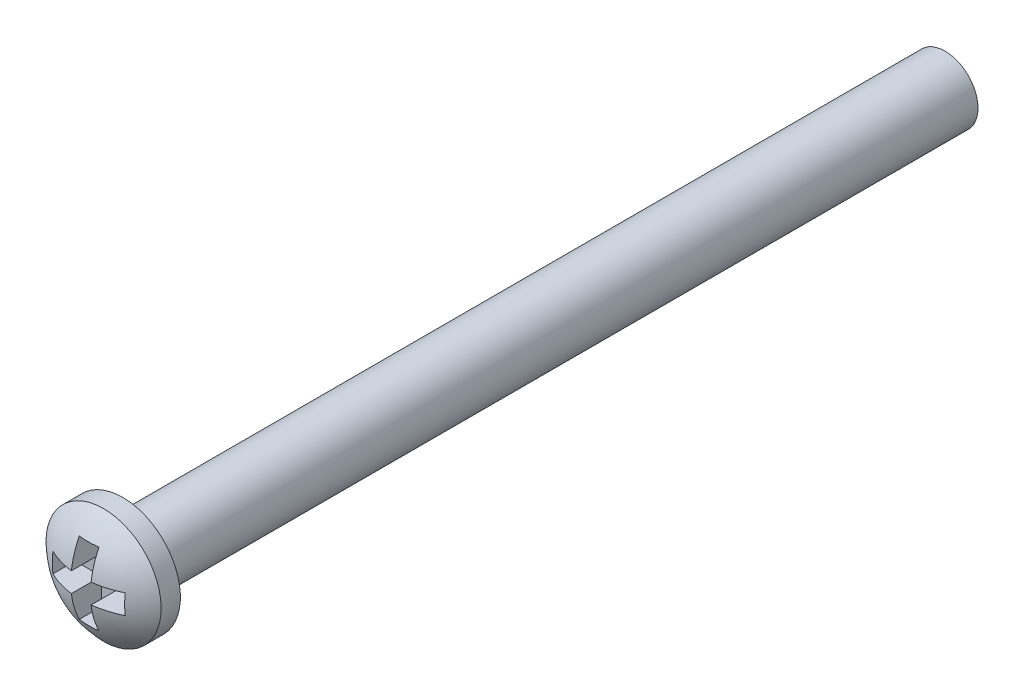
ISO-10303-21;
HEADER;
FILE_DESCRIPTION(('STEP AP214'),'2;1');
FILE_NAME('part.step','',(''),(''),'','','');
FILE_SCHEMA(('AUTOMOTIVE_DESIGN { 1 0 10303 214 1 1 1 1 }'));
ENDSEC;
DATA;
#1=APPLICATION_CONTEXT('core data for automotive mechanical design processes');
#2=APPLICATION_PROTOCOL_DEFINITION('international standard','automotive_design',2000,#1);
#3=PRODUCT_CONTEXT('',#1,'mechanical');
#4=PRODUCT('Part','Part','',(#3));
#5=PRODUCT_RELATED_PRODUCT_CATEGORY('part','',(#4));
#6=PRODUCT_DEFINITION_FORMATION('','',#4);
#7=PRODUCT_DEFINITION_CONTEXT('part definition',#1,'design');
#8=PRODUCT_DEFINITION('design','',#6,#7);
#9=PRODUCT_DEFINITION_SHAPE('','',#8);
#10=(LENGTH_UNIT() NAMED_UNIT(*) SI_UNIT(.MILLI.,.METRE.));
#11=(NAMED_UNIT(*) PLANE_ANGLE_UNIT() SI_UNIT($,.RADIAN.));
#12=(NAMED_UNIT(*) SI_UNIT($,.STERADIAN.) SOLID_ANGLE_UNIT());
#13=UNCERTAINTY_MEASURE_WITH_UNIT(LENGTH_MEASURE(1.E-05),#10,'distance_accuracy_value','');
#14=(GEOMETRIC_REPRESENTATION_CONTEXT(3) GLOBAL_UNCERTAINTY_ASSIGNED_CONTEXT((#13)) GLOBAL_UNIT_ASSIGNED_CONTEXT((#10,
#11,#12)) REPRESENTATION_CONTEXT('',''));
#15=CARTESIAN_POINT('',(0.,0.,0.));
#16=DIRECTION('',(0.,0.,1.));
#17=DIRECTION('',(1.,0.,0.));
#18=AXIS2_PLACEMENT_3D('',#15,#16,#17);
#19=CARTESIAN_POINT('',(0.,0.,-25.));
#20=DIRECTION('',(0.,0.,1.));
#21=DIRECTION('',(1.,0.,0.));
#22=AXIS2_PLACEMENT_3D('',#19,#20,#21);
#23=CYLINDRICAL_SURFACE('',#22,1.);
#24=CARTESIAN_POINT('',(0.,0.,-25.));
#25=DIRECTION('',(0.,0.,1.));
#26=DIRECTION('',(1.,0.,0.));
#27=AXIS2_PLACEMENT_3D('',#24,#25,#26);
#28=CIRCLE('',#27,1.);
#29=CARTESIAN_POINT('',(1.,0.,-25.));
#30=VERTEX_POINT('',#29);
#31=EDGE_CURVE('E212',#30,#30,#28,.T.);
#32=ORIENTED_EDGE('',*,*,#31,.T.);
#33=EDGE_LOOP('',(#32));
#34=FACE_BOUND('',#33,.T.);
#35=CARTESIAN_POINT('',(0.,0.,0.));
#36=DIRECTION('',(0.,0.,1.));
#37=DIRECTION('',(1.,0.,0.));
#38=AXIS2_PLACEMENT_3D('',#35,#36,#37);
#39=CIRCLE('',#38,1.);
#40=CARTESIAN_POINT('',(1.,0.,0.));
#41=VERTEX_POINT('',#40);
#42=EDGE_CURVE('E208',#41,#41,#39,.T.);
#43=ORIENTED_EDGE('',*,*,#42,.F.);
#44=EDGE_LOOP('',(#43));
#45=FACE_BOUND('',#44,.T.);
#46=ADVANCED_FACE('F41',(#34,#45),#23,.T.);
#47=CARTESIAN_POINT('',(0.,0.,-25.));
#48=DIRECTION('',(0.,0.,1.));
#49=DIRECTION('',(1.,0.,0.));
#50=AXIS2_PLACEMENT_3D('',#47,#48,#49);
#51=PLANE('',#50);
#52=ORIENTED_EDGE('',*,*,#31,.F.);
#53=EDGE_LOOP('',(#52));
#54=FACE_BOUND('',#53,.T.);
#55=ADVANCED_FACE('F281',(#54),#51,.F.);
#56=CARTESIAN_POINT('',(0.,0.,0.));
#57=DIRECTION('',(0.,0.,1.));
#58=DIRECTION('',(1.,0.,0.));
#59=AXIS2_PLACEMENT_3D('',#56,#57,#58);
#60=PLANE('',#59);
#61=ORIENTED_EDGE('',*,*,#42,.T.);
#62=EDGE_LOOP('',(#61));
#63=FACE_BOUND('',#62,.T.);
#64=CARTESIAN_POINT('',(0.,0.,0.));
#65=DIRECTION('',(0.,0.,-1.));
#66=DIRECTION('',(-1.,0.,0.));
#67=AXIS2_PLACEMENT_3D('',#64,#65,#66);
#68=CIRCLE('',#67,1.75);
#69=CARTESIAN_POINT('',(-1.75,0.,0.));
#70=VERTEX_POINT('',#69);
#71=EDGE_CURVE('E210',#70,#70,#68,.T.);
#72=ORIENTED_EDGE('',*,*,#71,.T.);
#73=EDGE_LOOP('',(#72));
#74=FACE_BOUND('',#73,.T.);
#75=ADVANCED_FACE('F286',(#63,#74),#60,.F.);
#76=CARTESIAN_POINT('',(0.,0.,-2.));
#77=DIRECTION('',(0.,0.,-1.));
#78=DIRECTION('',(-1.,0.,0.));
#79=AXIS2_PLACEMENT_3D('',#76,#77,#78);
#80=CYLINDRICAL_SURFACE('',#79,1.75);
#81=ORIENTED_EDGE('',*,*,#71,.F.);
#82=EDGE_LOOP('',(#81));
#83=FACE_BOUND('',#82,.T.);
#84=CARTESIAN_POINT('',(0.,0.,0.585357107135713));
#85=DIRECTION('',(0.,0.,-1.));
#86=DIRECTION('',(-1.,0.,0.));
#87=AXIS2_PLACEMENT_3D('',#84,#85,#86);
#88=CIRCLE('',#87,1.75);
#89=CARTESIAN_POINT('',(-1.75,0.,0.585357107135713));
#90=VERTEX_POINT('',#89);
#91=EDGE_CURVE('E179',#90,#90,#88,.T.);
#92=ORIENTED_EDGE('',*,*,#91,.T.);
#93=EDGE_LOOP('',(#92));
#94=FACE_BOUND('',#93,.T.);
#95=ADVANCED_FACE('F300',(#83,#94),#80,.T.);
#96=CARTESIAN_POINT('',(0.,0.,-1.2));
#97=DIRECTION('',(0.,0.,-1.));
#98=DIRECTION('',(1.,0.,0.));
#99=AXIS2_PLACEMENT_3D('',#96,#97,#98);
#100=SPHERICAL_SURFACE('',#99,2.5);
#101=CARTESIAN_POINT('',(0.,-1.1,-1.2));
#102=DIRECTION('',(0.,-1.,0.));
#103=DIRECTION('',(0.,0.,-1.));
#104=AXIS2_PLACEMENT_3D('',#101,#102,#103);
#105=CIRCLE('',#104,2.24499443206437);
#106=CARTESIAN_POINT('',(0.3,-1.1,1.0248595461287));
#107=VERTEX_POINT('',#106);
#108=CARTESIAN_POINT('',(-0.3,-1.1,1.0248595461287));
#109=VERTEX_POINT('',#108);
#110=EDGE_CURVE('E211',#107,#109,#105,.T.);
#111=ORIENTED_EDGE('',*,*,#110,.T.);
#112=CARTESIAN_POINT('',(-0.3,0.,-1.2));
#113=DIRECTION('',(-1.,0.,0.));
#114=DIRECTION('',(0.,0.,1.));
#115=AXIS2_PLACEMENT_3D('',#112,#113,#114);
#116=CIRCLE('',#115,2.48193472919818);
#117=CARTESIAN_POINT('',(-0.3,-0.3,1.26373699895098));
#118=VERTEX_POINT('',#117);
#119=EDGE_CURVE('E11',#109,#118,#116,.T.);
#120=ORIENTED_EDGE('',*,*,#119,.T.);
#121=CARTESIAN_POINT('',(0.,-0.3,-1.2));
#122=DIRECTION('',(0.,-1.,0.));
#123=DIRECTION('',(0.,0.,-1.));
#124=AXIS2_PLACEMENT_3D('',#121,#122,#123);
#125=CIRCLE('',#124,2.48193472919818);
#126=CARTESIAN_POINT('',(-1.1,-0.3,1.0248595461287));
#127=VERTEX_POINT('',#126);
#128=EDGE_CURVE('E48',#118,#127,#125,.T.);
#129=ORIENTED_EDGE('',*,*,#128,.T.);
#130=CARTESIAN_POINT('',(-1.1,0.,-1.2));
#131=DIRECTION('',(-1.,0.,0.));
#132=DIRECTION('',(0.,0.,1.));
#133=AXIS2_PLACEMENT_3D('',#130,#131,#132);
#134=CIRCLE('',#133,2.24499443206437);
#135=CARTESIAN_POINT('',(-1.1,0.3,1.0248595461287));
#136=VERTEX_POINT('',#135);
#137=EDGE_CURVE('E245',#127,#136,#134,.T.);
#138=ORIENTED_EDGE('',*,*,#137,.T.);
#139=CARTESIAN_POINT('',(0.,0.3,-1.2));
#140=DIRECTION('',(0.,1.,0.));
#141=DIRECTION('',(0.,0.,1.));
#142=AXIS2_PLACEMENT_3D('',#139,#140,#141);
#143=CIRCLE('',#142,2.48193472919818);
#144=CARTESIAN_POINT('',(-0.3,0.3,1.26373699895098));
#145=VERTEX_POINT('',#144);
#146=EDGE_CURVE('E236',#136,#145,#143,.T.);
#147=ORIENTED_EDGE('',*,*,#146,.T.);
#148=CARTESIAN_POINT('',(-0.3,0.,-1.2));
#149=DIRECTION('',(-1.,0.,0.));
#150=DIRECTION('',(0.,0.,1.));
#151=AXIS2_PLACEMENT_3D('',#148,#149,#150);
#152=CIRCLE('',#151,2.48193472919818);
#153=CARTESIAN_POINT('',(-0.3,1.1,1.0248595461287));
#154=VERTEX_POINT('',#153);
#155=EDGE_CURVE('E237',#145,#154,#152,.T.);
#156=ORIENTED_EDGE('',*,*,#155,.T.);
#157=CARTESIAN_POINT('',(0.,1.1,-1.2));
#158=DIRECTION('',(0.,1.,0.));
#159=DIRECTION('',(0.,0.,1.));
#160=AXIS2_PLACEMENT_3D('',#157,#158,#159);
#161=CIRCLE('',#160,2.24499443206437);
#162=CARTESIAN_POINT('',(0.3,1.1,1.0248595461287));
#163=VERTEX_POINT('',#162);
#164=EDGE_CURVE('E231',#154,#163,#161,.T.);
#165=ORIENTED_EDGE('',*,*,#164,.T.);
#166=CARTESIAN_POINT('',(0.3,0.,-1.2));
#167=DIRECTION('',(1.,0.,0.));
#168=DIRECTION('',(0.,0.,-1.));
#169=AXIS2_PLACEMENT_3D('',#166,#167,#168);
#170=CIRCLE('',#169,2.48193472919818);
#171=CARTESIAN_POINT('',(0.3,0.3,1.26373699895098));
#172=VERTEX_POINT('',#171);
#173=EDGE_CURVE('E226',#163,#172,#170,.T.);
#174=ORIENTED_EDGE('',*,*,#173,.T.);
#175=CARTESIAN_POINT('',(0.,0.3,-1.2));
#176=DIRECTION('',(0.,1.,0.));
#177=DIRECTION('',(0.,0.,1.));
#178=AXIS2_PLACEMENT_3D('',#175,#176,#177);
#179=CIRCLE('',#178,2.48193472919818);
#180=CARTESIAN_POINT('',(1.1,0.3,1.0248595461287));
#181=VERTEX_POINT('',#180);
#182=EDGE_CURVE('E229',#172,#181,#179,.T.);
#183=ORIENTED_EDGE('',*,*,#182,.T.);
#184=CARTESIAN_POINT('',(1.1,0.,-1.2));
#185=DIRECTION('',(1.,0.,0.));
#186=DIRECTION('',(0.,0.,-1.));
#187=AXIS2_PLACEMENT_3D('',#184,#185,#186);
#188=CIRCLE('',#187,2.24499443206437);
#189=CARTESIAN_POINT('',(1.1,-0.3,1.0248595461287));
#190=VERTEX_POINT('',#189);
#191=EDGE_CURVE('E221',#181,#190,#188,.T.);
#192=ORIENTED_EDGE('',*,*,#191,.T.);
#193=CARTESIAN_POINT('',(0.,-0.3,-1.2));
#194=DIRECTION('',(0.,-1.,0.));
#195=DIRECTION('',(0.,0.,-1.));
#196=AXIS2_PLACEMENT_3D('',#193,#194,#195);
#197=CIRCLE('',#196,2.48193472919818);
#198=CARTESIAN_POINT('',(0.3,-0.3,1.26373699895098));
#199=VERTEX_POINT('',#198);
#200=EDGE_CURVE('E222',#190,#199,#197,.T.);
#201=ORIENTED_EDGE('',*,*,#200,.T.);
#202=CARTESIAN_POINT('',(0.3,0.,-1.2));
#203=DIRECTION('',(1.,0.,0.));
#204=DIRECTION('',(0.,0.,-1.));
#205=AXIS2_PLACEMENT_3D('',#202,#203,#204);
#206=CIRCLE('',#205,2.48193472919818);
#207=EDGE_CURVE('E219',#199,#107,#206,.T.);
#208=ORIENTED_EDGE('',*,*,#207,.T.);
#209=EDGE_LOOP('',(#111,#120,#129,#138,#147,#156,#165,#174,#183,#192,#201,#208));
#210=FACE_BOUND('',#209,.T.);
#211=ORIENTED_EDGE('',*,*,#91,.F.);
#212=EDGE_LOOP('',(#211));
#213=FACE_BOUND('',#212,.T.);
#214=ADVANCED_FACE('F243',(#210,#213),#100,.T.);
#215=CARTESIAN_POINT('',(-0.3,-0.3,0.35));
#216=DIRECTION('',(-1.,0.,0.));
#217=DIRECTION('',(0.,0.,1.));
#218=AXIS2_PLACEMENT_3D('',#215,#216,#217);
#219=PLANE('',#218);
#220=DIRECTION('',(0.,0.,1.));
#221=VECTOR('',#220,1.);
#222=CARTESIAN_POINT('',(-0.3,-1.1,0.35));
#223=LINE('',#222,#221);
#224=CARTESIAN_POINT('',(-0.3,-1.1,0.35));
#225=VERTEX_POINT('',#224);
#226=EDGE_CURVE('E54',#225,#109,#223,.T.);
#227=ORIENTED_EDGE('',*,*,#226,.F.);
#228=DIRECTION('',(0.,-1.,0.));
#229=VECTOR('',#228,1.);
#230=CARTESIAN_POINT('',(-0.3,-0.3,0.35));
#231=LINE('',#230,#229);
#232=CARTESIAN_POINT('',(-0.3,-0.3,0.35));
#233=VERTEX_POINT('',#232);
#234=EDGE_CURVE('E129',#233,#225,#231,.T.);
#235=ORIENTED_EDGE('',*,*,#234,.F.);
#236=DIRECTION('',(0.,0.,1.));
#237=VECTOR('',#236,1.);
#238=CARTESIAN_POINT('',(-0.3,-0.3,0.35));
#239=LINE('',#238,#237);
#240=EDGE_CURVE('E173',#233,#118,#239,.T.);
#241=ORIENTED_EDGE('',*,*,#240,.T.);
#242=ORIENTED_EDGE('',*,*,#119,.F.);
#243=EDGE_LOOP('',(#227,#235,#241,#242));
#244=FACE_BOUND('',#243,.T.);
#245=ADVANCED_FACE('F127',(#244),#219,.F.);
#246=CARTESIAN_POINT('',(-1.1,-0.3,0.35));
#247=DIRECTION('',(0.,-1.,0.));
#248=DIRECTION('',(0.,0.,-1.));
#249=AXIS2_PLACEMENT_3D('',#246,#247,#248);
#250=PLANE('',#249);
#251=ORIENTED_EDGE('',*,*,#240,.F.);
#252=DIRECTION('',(1.,0.,0.));
#253=VECTOR('',#252,1.);
#254=CARTESIAN_POINT('',(-1.1,-0.3,0.35));
#255=LINE('',#254,#253);
#256=CARTESIAN_POINT('',(-1.1,-0.3,0.35));
#257=VERTEX_POINT('',#256);
#258=EDGE_CURVE('E131',#257,#233,#255,.T.);
#259=ORIENTED_EDGE('',*,*,#258,.F.);
#260=DIRECTION('',(0.,0.,1.));
#261=VECTOR('',#260,1.);
#262=CARTESIAN_POINT('',(-1.1,-0.3,0.35));
#263=LINE('',#262,#261);
#264=EDGE_CURVE('E177',#257,#127,#263,.T.);
#265=ORIENTED_EDGE('',*,*,#264,.T.);
#266=ORIENTED_EDGE('',*,*,#128,.F.);
#267=EDGE_LOOP('',(#251,#259,#265,#266));
#268=FACE_BOUND('',#267,.T.);
#269=ADVANCED_FACE('F273',(#268),#250,.F.);
#270=CARTESIAN_POINT('',(-1.1,0.3,0.35));
#271=DIRECTION('',(-1.,0.,0.));
#272=DIRECTION('',(0.,0.,1.));
#273=AXIS2_PLACEMENT_3D('',#270,#271,#272);
#274=PLANE('',#273);
#275=ORIENTED_EDGE('',*,*,#264,.F.);
#276=DIRECTION('',(0.,-1.,0.));
#277=VECTOR('',#276,1.);
#278=CARTESIAN_POINT('',(-1.1,0.3,0.35));
#279=LINE('',#278,#277);
#280=CARTESIAN_POINT('',(-1.1,0.3,0.35));
#281=VERTEX_POINT('',#280);
#282=EDGE_CURVE('E175',#281,#257,#279,.T.);
#283=ORIENTED_EDGE('',*,*,#282,.F.);
#284=DIRECTION('',(0.,0.,1.));
#285=VECTOR('',#284,1.);
#286=CARTESIAN_POINT('',(-1.1,0.3,0.35));
#287=LINE('',#286,#285);
#288=EDGE_CURVE('E176',#281,#136,#287,.T.);
#289=ORIENTED_EDGE('',*,*,#288,.T.);
#290=ORIENTED_EDGE('',*,*,#137,.F.);
#291=EDGE_LOOP('',(#275,#283,#289,#290));
#292=FACE_BOUND('',#291,.T.);
#293=ADVANCED_FACE('F275',(#292),#274,.F.);
#294=CARTESIAN_POINT('',(-0.3,0.3,0.35));
#295=DIRECTION('',(0.,1.,0.));
#296=DIRECTION('',(0.,0.,1.));
#297=AXIS2_PLACEMENT_3D('',#294,#295,#296);
#298=PLANE('',#297);
#299=ORIENTED_EDGE('',*,*,#288,.F.);
#300=DIRECTION('',(-1.,0.,0.));
#301=VECTOR('',#300,1.);
#302=CARTESIAN_POINT('',(-0.3,0.3,0.35));
#303=LINE('',#302,#301);
#304=CARTESIAN_POINT('',(-0.3,0.3,0.35));
#305=VERTEX_POINT('',#304);
#306=EDGE_CURVE('E166',#305,#281,#303,.T.);
#307=ORIENTED_EDGE('',*,*,#306,.F.);
#308=DIRECTION('',(0.,0.,1.));
#309=VECTOR('',#308,1.);
#310=CARTESIAN_POINT('',(-0.3,0.3,0.35));
#311=LINE('',#310,#309);
#312=EDGE_CURVE('E181',#305,#145,#311,.T.);
#313=ORIENTED_EDGE('',*,*,#312,.T.);
#314=ORIENTED_EDGE('',*,*,#146,.F.);
#315=EDGE_LOOP('',(#299,#307,#313,#314));
#316=FACE_BOUND('',#315,.T.);
#317=ADVANCED_FACE('F269',(#316),#298,.F.);
#318=CARTESIAN_POINT('',(-0.3,1.1,0.35));
#319=DIRECTION('',(-1.,0.,0.));
#320=DIRECTION('',(0.,0.,1.));
#321=AXIS2_PLACEMENT_3D('',#318,#319,#320);
#322=PLANE('',#321);
#323=ORIENTED_EDGE('',*,*,#312,.F.);
#324=DIRECTION('',(0.,-1.,0.));
#325=VECTOR('',#324,1.);
#326=CARTESIAN_POINT('',(-0.3,1.1,0.35));
#327=LINE('',#326,#325);
#328=CARTESIAN_POINT('',(-0.3,1.1,0.35));
#329=VERTEX_POINT('',#328);
#330=EDGE_CURVE('E167',#329,#305,#327,.T.);
#331=ORIENTED_EDGE('',*,*,#330,.F.);
#332=DIRECTION('',(0.,0.,1.));
#333=VECTOR('',#332,1.);
#334=CARTESIAN_POINT('',(-0.3,1.1,0.35));
#335=LINE('',#334,#333);
#336=EDGE_CURVE('E188',#329,#154,#335,.T.);
#337=ORIENTED_EDGE('',*,*,#336,.T.);
#338=ORIENTED_EDGE('',*,*,#155,.F.);
#339=EDGE_LOOP('',(#323,#331,#337,#338));
#340=FACE_BOUND('',#339,.T.);
#341=ADVANCED_FACE('F266',(#340),#322,.F.);
#342=CARTESIAN_POINT('',(0.3,1.1,0.35));
#343=DIRECTION('',(0.,1.,0.));
#344=DIRECTION('',(0.,0.,1.));
#345=AXIS2_PLACEMENT_3D('',#342,#343,#344);
#346=PLANE('',#345);
#347=ORIENTED_EDGE('',*,*,#336,.F.);
#348=DIRECTION('',(-1.,0.,0.));
#349=VECTOR('',#348,1.);
#350=CARTESIAN_POINT('',(0.3,1.1,0.35));
#351=LINE('',#350,#349);
#352=CARTESIAN_POINT('',(0.3,1.1,0.35));
#353=VERTEX_POINT('',#352);
#354=EDGE_CURVE('E164',#353,#329,#351,.T.);
#355=ORIENTED_EDGE('',*,*,#354,.F.);
#356=DIRECTION('',(0.,0.,1.));
#357=VECTOR('',#356,1.);
#358=CARTESIAN_POINT('',(0.3,1.1,0.35));
#359=LINE('',#358,#357);
#360=EDGE_CURVE('E189',#353,#163,#359,.T.);
#361=ORIENTED_EDGE('',*,*,#360,.T.);
#362=ORIENTED_EDGE('',*,*,#164,.F.);
#363=EDGE_LOOP('',(#347,#355,#361,#362));
#364=FACE_BOUND('',#363,.T.);
#365=ADVANCED_FACE('F261',(#364),#346,.F.);
#366=CARTESIAN_POINT('',(0.3,0.3,0.35));
#367=DIRECTION('',(1.,0.,0.));
#368=DIRECTION('',(0.,0.,-1.));
#369=AXIS2_PLACEMENT_3D('',#366,#367,#368);
#370=PLANE('',#369);
#371=ORIENTED_EDGE('',*,*,#360,.F.);
#372=DIRECTION('',(0.,1.,0.));
#373=VECTOR('',#372,1.);
#374=CARTESIAN_POINT('',(0.3,0.3,0.35));
#375=LINE('',#374,#373);
#376=CARTESIAN_POINT('',(0.3,0.3,0.35));
#377=VERTEX_POINT('',#376);
#378=EDGE_CURVE('E158',#377,#353,#375,.T.);
#379=ORIENTED_EDGE('',*,*,#378,.F.);
#380=DIRECTION('',(0.,0.,1.));
#381=VECTOR('',#380,1.);
#382=CARTESIAN_POINT('',(0.3,0.3,0.35));
#383=LINE('',#382,#381);
#384=EDGE_CURVE('E195',#377,#172,#383,.T.);
#385=ORIENTED_EDGE('',*,*,#384,.T.);
#386=ORIENTED_EDGE('',*,*,#173,.F.);
#387=EDGE_LOOP('',(#371,#379,#385,#386));
#388=FACE_BOUND('',#387,.T.);
#389=ADVANCED_FACE('F263',(#388),#370,.F.);
#390=CARTESIAN_POINT('',(1.1,0.3,0.35));
#391=DIRECTION('',(0.,1.,0.));
#392=DIRECTION('',(0.,0.,1.));
#393=AXIS2_PLACEMENT_3D('',#390,#391,#392);
#394=PLANE('',#393);
#395=ORIENTED_EDGE('',*,*,#384,.F.);
#396=DIRECTION('',(-1.,0.,0.));
#397=VECTOR('',#396,1.);
#398=CARTESIAN_POINT('',(1.1,0.3,0.35));
#399=LINE('',#398,#397);
#400=CARTESIAN_POINT('',(1.1,0.3,0.35));
#401=VERTEX_POINT('',#400);
#402=EDGE_CURVE('E160',#401,#377,#399,.T.);
#403=ORIENTED_EDGE('',*,*,#402,.F.);
#404=DIRECTION('',(0.,0.,1.));
#405=VECTOR('',#404,1.);
#406=CARTESIAN_POINT('',(1.1,0.3,0.35));
#407=LINE('',#406,#405);
#408=EDGE_CURVE('E194',#401,#181,#407,.T.);
#409=ORIENTED_EDGE('',*,*,#408,.T.);
#410=ORIENTED_EDGE('',*,*,#182,.F.);
#411=EDGE_LOOP('',(#395,#403,#409,#410));
#412=FACE_BOUND('',#411,.T.);
#413=ADVANCED_FACE('F257',(#412),#394,.F.);
#414=CARTESIAN_POINT('',(1.1,-0.3,0.35));
#415=DIRECTION('',(1.,0.,0.));
#416=DIRECTION('',(0.,0.,-1.));
#417=AXIS2_PLACEMENT_3D('',#414,#415,#416);
#418=PLANE('',#417);
#419=ORIENTED_EDGE('',*,*,#408,.F.);
#420=DIRECTION('',(0.,1.,0.));
#421=VECTOR('',#420,1.);
#422=CARTESIAN_POINT('',(1.1,-0.3,0.35));
#423=LINE('',#422,#421);
#424=CARTESIAN_POINT('',(1.1,-0.3,0.35));
#425=VERTEX_POINT('',#424);
#426=EDGE_CURVE('E155',#425,#401,#423,.T.);
#427=ORIENTED_EDGE('',*,*,#426,.F.);
#428=DIRECTION('',(0.,0.,1.));
#429=VECTOR('',#428,1.);
#430=CARTESIAN_POINT('',(1.1,-0.3,0.35));
#431=LINE('',#430,#429);
#432=EDGE_CURVE('E198',#425,#190,#431,.T.);
#433=ORIENTED_EDGE('',*,*,#432,.T.);
#434=ORIENTED_EDGE('',*,*,#191,.F.);
#435=EDGE_LOOP('',(#419,#427,#433,#434));
#436=FACE_BOUND('',#435,.T.);
#437=ADVANCED_FACE('F255',(#436),#418,.F.);
#438=CARTESIAN_POINT('',(0.3,-0.3,0.35));
#439=DIRECTION('',(0.,-1.,0.));
#440=DIRECTION('',(0.,0.,-1.));
#441=AXIS2_PLACEMENT_3D('',#438,#439,#440);
#442=PLANE('',#441);
#443=ORIENTED_EDGE('',*,*,#432,.F.);
#444=DIRECTION('',(1.,0.,0.));
#445=VECTOR('',#444,1.);
#446=CARTESIAN_POINT('',(0.3,-0.3,0.35));
#447=LINE('',#446,#445);
#448=CARTESIAN_POINT('',(0.3,-0.3,0.35));
#449=VERTEX_POINT('',#448);
#450=EDGE_CURVE('E153',#449,#425,#447,.T.);
#451=ORIENTED_EDGE('',*,*,#450,.F.);
#452=DIRECTION('',(0.,0.,1.));
#453=VECTOR('',#452,1.);
#454=CARTESIAN_POINT('',(0.3,-0.3,0.35));
#455=LINE('',#454,#453);
#456=EDGE_CURVE('E201',#449,#199,#455,.T.);
#457=ORIENTED_EDGE('',*,*,#456,.T.);
#458=ORIENTED_EDGE('',*,*,#200,.F.);
#459=EDGE_LOOP('',(#443,#451,#457,#458));
#460=FACE_BOUND('',#459,.T.);
#461=ADVANCED_FACE('F254',(#460),#442,.F.);
#462=CARTESIAN_POINT('',(0.3,-1.1,0.35));
#463=DIRECTION('',(1.,0.,0.));
#464=DIRECTION('',(0.,0.,-1.));
#465=AXIS2_PLACEMENT_3D('',#462,#463,#464);
#466=PLANE('',#465);
#467=ORIENTED_EDGE('',*,*,#456,.F.);
#468=DIRECTION('',(0.,1.,0.));
#469=VECTOR('',#468,1.);
#470=CARTESIAN_POINT('',(0.3,-1.1,0.35));
#471=LINE('',#470,#469);
#472=CARTESIAN_POINT('',(0.3,-1.1,0.35));
#473=VERTEX_POINT('',#472);
#474=EDGE_CURVE('E144',#473,#449,#471,.T.);
#475=ORIENTED_EDGE('',*,*,#474,.F.);
#476=DIRECTION('',(0.,0.,1.));
#477=VECTOR('',#476,1.);
#478=CARTESIAN_POINT('',(0.3,-1.1,0.35));
#479=LINE('',#478,#477);
#480=EDGE_CURVE('E134',#473,#107,#479,.T.);
#481=ORIENTED_EDGE('',*,*,#480,.T.);
#482=ORIENTED_EDGE('',*,*,#207,.F.);
#483=EDGE_LOOP('',(#467,#475,#481,#482));
#484=FACE_BOUND('',#483,.T.);
#485=ADVANCED_FACE('F249',(#484),#466,.F.);
#486=CARTESIAN_POINT('',(-0.3,-1.1,0.35));
#487=DIRECTION('',(0.,-1.,0.));
#488=DIRECTION('',(0.,0.,-1.));
#489=AXIS2_PLACEMENT_3D('',#486,#487,#488);
#490=PLANE('',#489);
#491=ORIENTED_EDGE('',*,*,#480,.F.);
#492=DIRECTION('',(1.,0.,0.));
#493=VECTOR('',#492,1.);
#494=CARTESIAN_POINT('',(-0.3,-1.1,0.35));
#495=LINE('',#494,#493);
#496=EDGE_CURVE('E140',#225,#473,#495,.T.);
#497=ORIENTED_EDGE('',*,*,#496,.F.);
#498=ORIENTED_EDGE('',*,*,#226,.T.);
#499=ORIENTED_EDGE('',*,*,#110,.F.);
#500=EDGE_LOOP('',(#491,#497,#498,#499));
#501=FACE_BOUND('',#500,.T.);
#502=ADVANCED_FACE('F139',(#501),#490,.F.);
#503=CARTESIAN_POINT('',(0.,0.,0.35));
#504=DIRECTION('',(0.,0.,1.));
#505=DIRECTION('',(1.,0.,0.));
#506=AXIS2_PLACEMENT_3D('',#503,#504,#505);
#507=PLANE('',#506);
#508=ORIENTED_EDGE('',*,*,#234,.T.);
#509=ORIENTED_EDGE('',*,*,#496,.T.);
#510=ORIENTED_EDGE('',*,*,#474,.T.);
#511=ORIENTED_EDGE('',*,*,#450,.T.);
#512=ORIENTED_EDGE('',*,*,#426,.T.);
#513=ORIENTED_EDGE('',*,*,#402,.T.);
#514=ORIENTED_EDGE('',*,*,#378,.T.);
#515=ORIENTED_EDGE('',*,*,#354,.T.);
#516=ORIENTED_EDGE('',*,*,#330,.T.);
#517=ORIENTED_EDGE('',*,*,#306,.T.);
#518=ORIENTED_EDGE('',*,*,#282,.T.);
#519=ORIENTED_EDGE('',*,*,#258,.T.);
#520=EDGE_LOOP('',(#508,#509,#510,#511,#512,#513,#514,#515,#516,#517,#518,#519));
#521=FACE_BOUND('',#520,.T.);
#522=ADVANCED_FACE('F143',(#521),#507,.T.);
#523=CLOSED_SHELL('',(#46,#55,#75,#95,#214,#245,#269,#293,#317,#341,#365,#389,#413,#437,#461,
#485,#502,#522));
#524=MANIFOLD_SOLID_BREP('B2',#523);
#525=ADVANCED_BREP_SHAPE_REPRESENTATION('',(#18,#524),#14);
#526=SHAPE_DEFINITION_REPRESENTATION(#9,#525);
ENDSEC;
END-ISO-10303-21;
